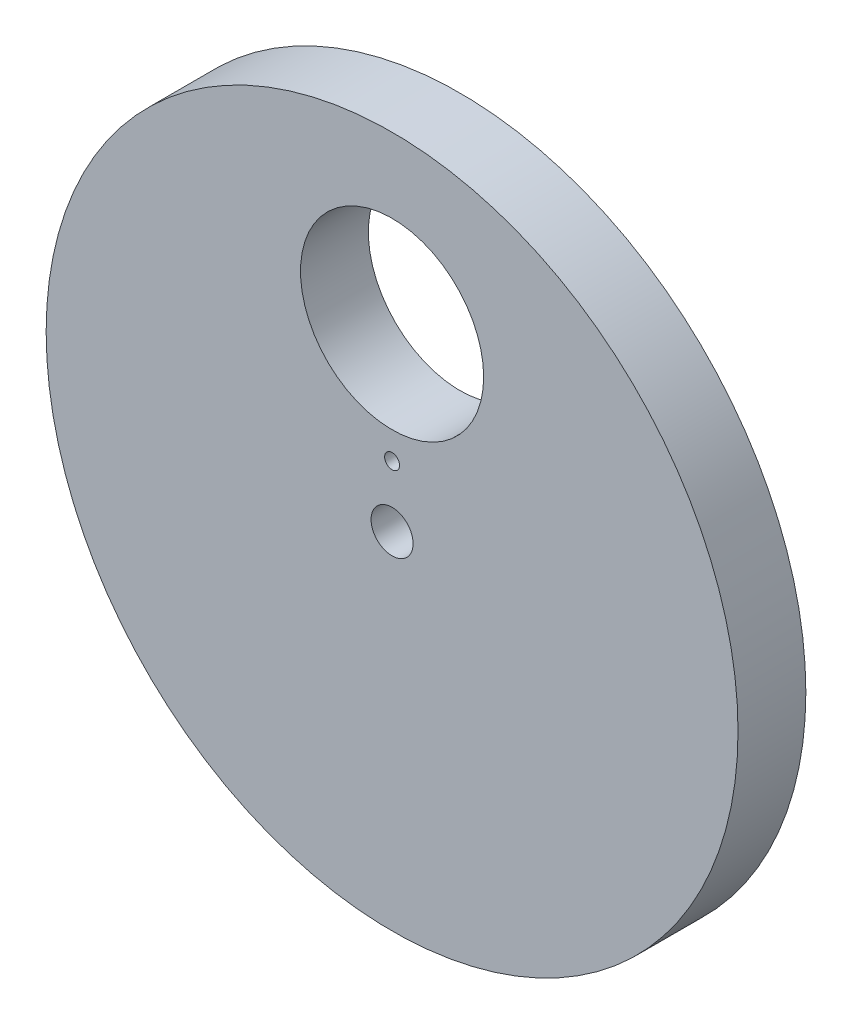
ISO-10303-21;
HEADER;
FILE_DESCRIPTION(('STEP AP214'),'2;1');
FILE_NAME('part.step','',(''),(''),'','','');
FILE_SCHEMA(('AUTOMOTIVE_DESIGN { 1 0 10303 214 1 1 1 1 }'));
ENDSEC;
DATA;
#1=APPLICATION_CONTEXT('core data for automotive mechanical design processes');
#2=APPLICATION_PROTOCOL_DEFINITION('international standard','automotive_design',2000,#1);
#3=PRODUCT_CONTEXT('',#1,'mechanical');
#4=PRODUCT('Part','Part','',(#3));
#5=PRODUCT_RELATED_PRODUCT_CATEGORY('part','',(#4));
#6=PRODUCT_DEFINITION_FORMATION('','',#4);
#7=PRODUCT_DEFINITION_CONTEXT('part definition',#1,'design');
#8=PRODUCT_DEFINITION('design','',#6,#7);
#9=PRODUCT_DEFINITION_SHAPE('','',#8);
#10=(LENGTH_UNIT() NAMED_UNIT(*) SI_UNIT(.MILLI.,.METRE.));
#11=(NAMED_UNIT(*) PLANE_ANGLE_UNIT() SI_UNIT($,.RADIAN.));
#12=(NAMED_UNIT(*) SI_UNIT($,.STERADIAN.) SOLID_ANGLE_UNIT());
#13=UNCERTAINTY_MEASURE_WITH_UNIT(LENGTH_MEASURE(1.E-05),#10,'distance_accuracy_value','');
#14=(GEOMETRIC_REPRESENTATION_CONTEXT(3) GLOBAL_UNCERTAINTY_ASSIGNED_CONTEXT((#13)) GLOBAL_UNIT_ASSIGNED_CONTEXT((#10,
#11,#12)) REPRESENTATION_CONTEXT('',''));
#15=CARTESIAN_POINT('',(0.,0.,0.));
#16=DIRECTION('',(0.,0.,1.));
#17=DIRECTION('',(1.,0.,0.));
#18=AXIS2_PLACEMENT_3D('',#15,#16,#17);
#19=CARTESIAN_POINT('',(0.,0.,5.));
#20=DIRECTION('',(0.,0.,-1.));
#21=DIRECTION('',(-1.,0.,0.));
#22=AXIS2_PLACEMENT_3D('',#19,#20,#21);
#23=CYLINDRICAL_SURFACE('',#22,25.5);
#24=CARTESIAN_POINT('',(0.,0.,5.));
#25=DIRECTION('',(0.,0.,1.));
#26=DIRECTION('',(1.,0.,0.));
#27=AXIS2_PLACEMENT_3D('',#24,#25,#26);
#28=CIRCLE('',#27,25.5);
#29=CARTESIAN_POINT('',(25.5,0.,5.));
#30=VERTEX_POINT('',#29);
#31=EDGE_CURVE('E10',#30,#30,#28,.T.);
#32=ORIENTED_EDGE('',*,*,#31,.F.);
#33=EDGE_LOOP('',(#32));
#34=FACE_BOUND('',#33,.T.);
#35=CARTESIAN_POINT('',(0.,0.,0.));
#36=DIRECTION('',(0.,0.,1.));
#37=DIRECTION('',(1.,0.,0.));
#38=AXIS2_PLACEMENT_3D('',#35,#36,#37);
#39=CIRCLE('',#38,25.5);
#40=CARTESIAN_POINT('',(25.5,0.,0.));
#41=VERTEX_POINT('',#40);
#42=EDGE_CURVE('E40',#41,#41,#39,.T.);
#43=ORIENTED_EDGE('',*,*,#42,.T.);
#44=EDGE_LOOP('',(#43));
#45=FACE_BOUND('',#44,.T.);
#46=ADVANCED_FACE('F37',(#34,#45),#23,.T.);
#47=CARTESIAN_POINT('',(0.,0.,5.));
#48=DIRECTION('',(0.,0.,1.));
#49=DIRECTION('',(1.,0.,0.));
#50=AXIS2_PLACEMENT_3D('',#47,#48,#49);
#51=PLANE('',#50);
#52=CARTESIAN_POINT('',(0.,0.,5.));
#53=DIRECTION('',(0.,0.,1.));
#54=DIRECTION('',(1.,0.,0.));
#55=AXIS2_PLACEMENT_3D('',#52,#53,#54);
#56=CIRCLE('',#55,1.55);
#57=CARTESIAN_POINT('',(1.55,0.,5.));
#58=VERTEX_POINT('',#57);
#59=EDGE_CURVE('E49',#58,#58,#56,.T.);
#60=ORIENTED_EDGE('',*,*,#59,.F.);
#61=EDGE_LOOP('',(#60));
#62=FACE_BOUND('',#61,.T.);
#63=CARTESIAN_POINT('',(0.,4.5,5.));
#64=DIRECTION('',(0.,0.,1.));
#65=DIRECTION('',(1.,0.,0.));
#66=AXIS2_PLACEMENT_3D('',#63,#64,#65);
#67=CIRCLE('',#66,0.55);
#68=CARTESIAN_POINT('',(0.55,4.5,5.));
#69=VERTEX_POINT('',#68);
#70=EDGE_CURVE('E54',#69,#69,#67,.T.);
#71=ORIENTED_EDGE('',*,*,#70,.F.);
#72=EDGE_LOOP('',(#71));
#73=FACE_BOUND('',#72,.T.);
#74=CARTESIAN_POINT('',(0.,13.25,5.));
#75=DIRECTION('',(0.,0.,1.));
#76=DIRECTION('',(1.,0.,0.));
#77=AXIS2_PLACEMENT_3D('',#74,#75,#76);
#78=CIRCLE('',#77,6.75);
#79=CARTESIAN_POINT('',(6.75,13.25,5.));
#80=VERTEX_POINT('',#79);
#81=EDGE_CURVE('E58',#80,#80,#78,.T.);
#82=ORIENTED_EDGE('',*,*,#81,.F.);
#83=EDGE_LOOP('',(#82));
#84=FACE_BOUND('',#83,.T.);
#85=ORIENTED_EDGE('',*,*,#31,.T.);
#86=EDGE_LOOP('',(#85));
#87=FACE_BOUND('',#86,.T.);
#88=ADVANCED_FACE('F90',(#62,#73,#84,#87),#51,.T.);
#89=CARTESIAN_POINT('',(0.,0.,0.));
#90=DIRECTION('',(0.,0.,1.));
#91=DIRECTION('',(1.,0.,0.));
#92=AXIS2_PLACEMENT_3D('',#89,#90,#91);
#93=PLANE('',#92);
#94=CARTESIAN_POINT('',(0.,0.,0.));
#95=DIRECTION('',(0.,0.,1.));
#96=DIRECTION('',(1.,0.,0.));
#97=AXIS2_PLACEMENT_3D('',#94,#95,#96);
#98=CIRCLE('',#97,1.55);
#99=CARTESIAN_POINT('',(1.55,0.,0.));
#100=VERTEX_POINT('',#99);
#101=EDGE_CURVE('E62',#100,#100,#98,.T.);
#102=ORIENTED_EDGE('',*,*,#101,.T.);
#103=EDGE_LOOP('',(#102));
#104=FACE_BOUND('',#103,.T.);
#105=CARTESIAN_POINT('',(0.,4.5,0.));
#106=DIRECTION('',(0.,0.,1.));
#107=DIRECTION('',(1.,0.,0.));
#108=AXIS2_PLACEMENT_3D('',#105,#106,#107);
#109=CIRCLE('',#108,0.55);
#110=CARTESIAN_POINT('',(0.55,4.5,0.));
#111=VERTEX_POINT('',#110);
#112=EDGE_CURVE('E67',#111,#111,#109,.T.);
#113=ORIENTED_EDGE('',*,*,#112,.T.);
#114=EDGE_LOOP('',(#113));
#115=FACE_BOUND('',#114,.T.);
#116=CARTESIAN_POINT('',(0.,13.25,0.));
#117=DIRECTION('',(0.,0.,1.));
#118=DIRECTION('',(1.,0.,0.));
#119=AXIS2_PLACEMENT_3D('',#116,#117,#118);
#120=CIRCLE('',#119,6.75);
#121=CARTESIAN_POINT('',(6.75,13.25,0.));
#122=VERTEX_POINT('',#121);
#123=EDGE_CURVE('E63',#122,#122,#120,.T.);
#124=ORIENTED_EDGE('',*,*,#123,.T.);
#125=EDGE_LOOP('',(#124));
#126=FACE_BOUND('',#125,.T.);
#127=ORIENTED_EDGE('',*,*,#42,.F.);
#128=EDGE_LOOP('',(#127));
#129=FACE_BOUND('',#128,.T.);
#130=ADVANCED_FACE('F75',(#104,#115,#126,#129),#93,.F.);
#131=CARTESIAN_POINT('',(0.,13.25,0.));
#132=DIRECTION('',(0.,0.,1.));
#133=DIRECTION('',(1.,0.,0.));
#134=AXIS2_PLACEMENT_3D('',#131,#132,#133);
#135=CYLINDRICAL_SURFACE('',#134,6.75);
#136=ORIENTED_EDGE('',*,*,#81,.T.);
#137=EDGE_LOOP('',(#136));
#138=FACE_BOUND('',#137,.T.);
#139=ORIENTED_EDGE('',*,*,#123,.F.);
#140=EDGE_LOOP('',(#139));
#141=FACE_BOUND('',#140,.T.);
#142=ADVANCED_FACE('F86',(#138,#141),#135,.F.);
#143=CARTESIAN_POINT('',(0.,4.5,0.));
#144=DIRECTION('',(0.,0.,1.));
#145=DIRECTION('',(1.,0.,0.));
#146=AXIS2_PLACEMENT_3D('',#143,#144,#145);
#147=CYLINDRICAL_SURFACE('',#146,0.55);
#148=ORIENTED_EDGE('',*,*,#70,.T.);
#149=EDGE_LOOP('',(#148));
#150=FACE_BOUND('',#149,.T.);
#151=ORIENTED_EDGE('',*,*,#112,.F.);
#152=EDGE_LOOP('',(#151));
#153=FACE_BOUND('',#152,.T.);
#154=ADVANCED_FACE('F80',(#150,#153),#147,.F.);
#155=CARTESIAN_POINT('',(0.,0.,0.));
#156=DIRECTION('',(0.,0.,1.));
#157=DIRECTION('',(1.,0.,0.));
#158=AXIS2_PLACEMENT_3D('',#155,#156,#157);
#159=CYLINDRICAL_SURFACE('',#158,1.55);
#160=ORIENTED_EDGE('',*,*,#59,.T.);
#161=EDGE_LOOP('',(#160));
#162=FACE_BOUND('',#161,.T.);
#163=ORIENTED_EDGE('',*,*,#101,.F.);
#164=EDGE_LOOP('',(#163));
#165=FACE_BOUND('',#164,.T.);
#166=ADVANCED_FACE('F78',(#162,#165),#159,.F.);
#167=CLOSED_SHELL('',(#46,#88,#130,#142,#154,#166));
#168=MANIFOLD_SOLID_BREP('B2',#167);
#169=ADVANCED_BREP_SHAPE_REPRESENTATION('',(#18,#168),#14);
#170=SHAPE_DEFINITION_REPRESENTATION(#9,#169);
ENDSEC;
END-ISO-10303-21;
